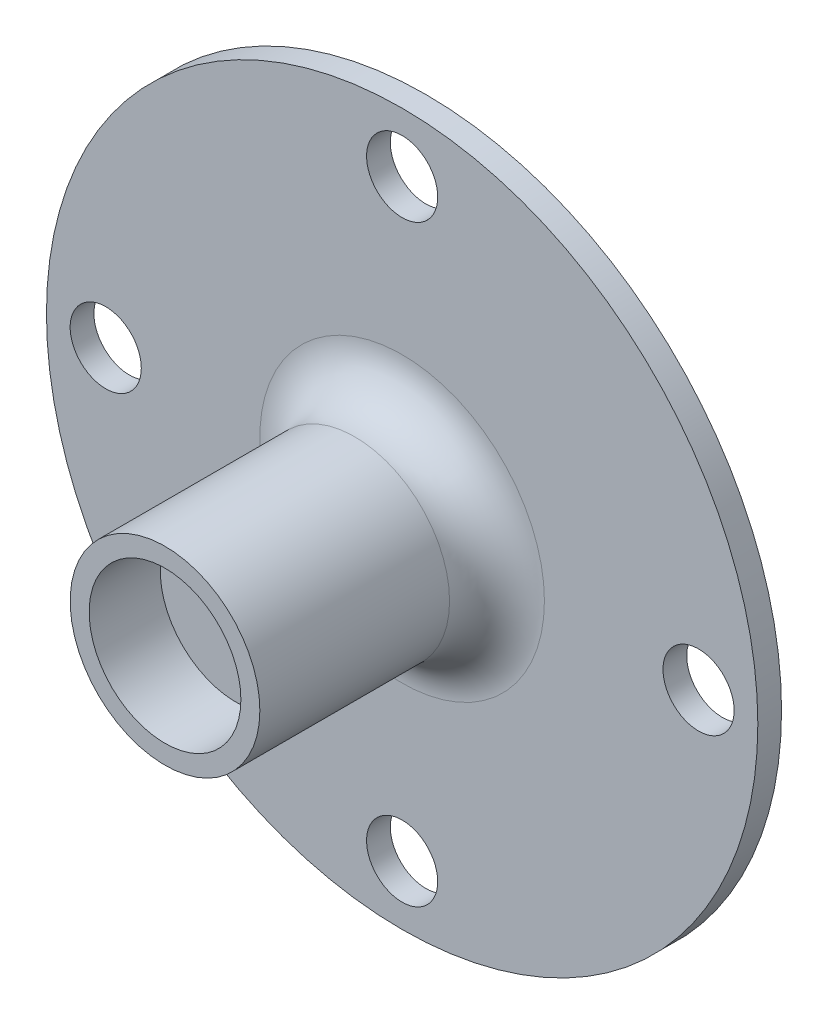
ISO-10303-21;
HEADER;
FILE_DESCRIPTION(('STEP AP214'),'2;1');
FILE_NAME('part.step','',(''),(''),'','','');
FILE_SCHEMA(('AUTOMOTIVE_DESIGN { 1 0 10303 214 1 1 1 1 }'));
ENDSEC;
DATA;
#1=APPLICATION_CONTEXT('core data for automotive mechanical design processes');
#2=APPLICATION_PROTOCOL_DEFINITION('international standard','automotive_design',2000,#1);
#3=PRODUCT_CONTEXT('',#1,'mechanical');
#4=PRODUCT('Part','Part','',(#3));
#5=PRODUCT_RELATED_PRODUCT_CATEGORY('part','',(#4));
#6=PRODUCT_DEFINITION_FORMATION('','',#4);
#7=PRODUCT_DEFINITION_CONTEXT('part definition',#1,'design');
#8=PRODUCT_DEFINITION('design','',#6,#7);
#9=PRODUCT_DEFINITION_SHAPE('','',#8);
#10=(LENGTH_UNIT() NAMED_UNIT(*) SI_UNIT(.MILLI.,.METRE.));
#11=(NAMED_UNIT(*) PLANE_ANGLE_UNIT() SI_UNIT($,.RADIAN.));
#12=(NAMED_UNIT(*) SI_UNIT($,.STERADIAN.) SOLID_ANGLE_UNIT());
#13=UNCERTAINTY_MEASURE_WITH_UNIT(LENGTH_MEASURE(1.E-05),#10,'distance_accuracy_value','');
#14=(GEOMETRIC_REPRESENTATION_CONTEXT(3) GLOBAL_UNCERTAINTY_ASSIGNED_CONTEXT((#13)) GLOBAL_UNIT_ASSIGNED_CONTEXT((#10,
#11,#12)) REPRESENTATION_CONTEXT('',''));
#15=CARTESIAN_POINT('',(0.,0.,0.));
#16=DIRECTION('',(0.,0.,1.));
#17=DIRECTION('',(1.,0.,0.));
#18=AXIS2_PLACEMENT_3D('',#15,#16,#17);
#19=CARTESIAN_POINT('',(-12.5,0.,1.));
#20=DIRECTION('',(0.,0.,-1.));
#21=DIRECTION('',(-1.,0.,0.));
#22=AXIS2_PLACEMENT_3D('',#19,#20,#21);
#23=CYLINDRICAL_SURFACE('',#22,1.5);
#24=CARTESIAN_POINT('',(-12.5,0.,1.));
#25=DIRECTION('',(0.,0.,1.));
#26=DIRECTION('',(1.,0.,0.));
#27=AXIS2_PLACEMENT_3D('',#24,#25,#26);
#28=CIRCLE('',#27,1.5);
#29=CARTESIAN_POINT('',(-11.,0.,1.));
#30=VERTEX_POINT('',#29);
#31=EDGE_CURVE('E70',#30,#30,#28,.T.);
#32=ORIENTED_EDGE('',*,*,#31,.T.);
#33=EDGE_LOOP('',(#32));
#34=FACE_BOUND('',#33,.T.);
#35=CARTESIAN_POINT('',(-12.5,0.,0.));
#36=DIRECTION('',(0.,0.,1.));
#37=DIRECTION('',(1.,0.,0.));
#38=AXIS2_PLACEMENT_3D('',#35,#36,#37);
#39=CIRCLE('',#38,1.5);
#40=CARTESIAN_POINT('',(-11.,0.,0.));
#41=VERTEX_POINT('',#40);
#42=EDGE_CURVE('E55',#41,#41,#39,.T.);
#43=ORIENTED_EDGE('',*,*,#42,.F.);
#44=EDGE_LOOP('',(#43));
#45=FACE_BOUND('',#44,.T.);
#46=ADVANCED_FACE('F33',(#34,#45),#23,.F.);
#47=CARTESIAN_POINT('',(0.,-12.5,1.));
#48=DIRECTION('',(0.,0.,-1.));
#49=DIRECTION('',(-1.,0.,0.));
#50=AXIS2_PLACEMENT_3D('',#47,#48,#49);
#51=CYLINDRICAL_SURFACE('',#50,1.5);
#52=CARTESIAN_POINT('',(0.,-12.5,1.));
#53=DIRECTION('',(0.,0.,1.));
#54=DIRECTION('',(1.,0.,0.));
#55=AXIS2_PLACEMENT_3D('',#52,#53,#54);
#56=CIRCLE('',#55,1.5);
#57=CARTESIAN_POINT('',(1.5,-12.5,1.));
#58=VERTEX_POINT('',#57);
#59=EDGE_CURVE('E73',#58,#58,#56,.T.);
#60=ORIENTED_EDGE('',*,*,#59,.T.);
#61=EDGE_LOOP('',(#60));
#62=FACE_BOUND('',#61,.T.);
#63=CARTESIAN_POINT('',(0.,-12.5,0.));
#64=DIRECTION('',(0.,0.,1.));
#65=DIRECTION('',(1.,0.,0.));
#66=AXIS2_PLACEMENT_3D('',#63,#64,#65);
#67=CIRCLE('',#66,1.5);
#68=CARTESIAN_POINT('',(1.5,-12.5,0.));
#69=VERTEX_POINT('',#68);
#70=EDGE_CURVE('E58',#69,#69,#67,.T.);
#71=ORIENTED_EDGE('',*,*,#70,.F.);
#72=EDGE_LOOP('',(#71));
#73=FACE_BOUND('',#72,.T.);
#74=ADVANCED_FACE('F108',(#62,#73),#51,.F.);
#75=CARTESIAN_POINT('',(12.5,0.,1.));
#76=DIRECTION('',(0.,0.,-1.));
#77=DIRECTION('',(-1.,0.,0.));
#78=AXIS2_PLACEMENT_3D('',#75,#76,#77);
#79=CYLINDRICAL_SURFACE('',#78,1.5);
#80=CARTESIAN_POINT('',(12.5,0.,1.));
#81=DIRECTION('',(0.,0.,1.));
#82=DIRECTION('',(1.,0.,0.));
#83=AXIS2_PLACEMENT_3D('',#80,#81,#82);
#84=CIRCLE('',#83,1.5);
#85=CARTESIAN_POINT('',(14.,0.,1.));
#86=VERTEX_POINT('',#85);
#87=EDGE_CURVE('E76',#86,#86,#84,.T.);
#88=ORIENTED_EDGE('',*,*,#87,.T.);
#89=EDGE_LOOP('',(#88));
#90=FACE_BOUND('',#89,.T.);
#91=CARTESIAN_POINT('',(12.5,0.,0.));
#92=DIRECTION('',(0.,0.,1.));
#93=DIRECTION('',(1.,0.,0.));
#94=AXIS2_PLACEMENT_3D('',#91,#92,#93);
#95=CIRCLE('',#94,1.5);
#96=CARTESIAN_POINT('',(14.,0.,0.));
#97=VERTEX_POINT('',#96);
#98=EDGE_CURVE('E61',#97,#97,#95,.T.);
#99=ORIENTED_EDGE('',*,*,#98,.F.);
#100=EDGE_LOOP('',(#99));
#101=FACE_BOUND('',#100,.T.);
#102=ADVANCED_FACE('F114',(#90,#101),#79,.F.);
#103=CARTESIAN_POINT('',(0.,12.5,1.));
#104=DIRECTION('',(0.,0.,-1.));
#105=DIRECTION('',(-1.,0.,0.));
#106=AXIS2_PLACEMENT_3D('',#103,#104,#105);
#107=CYLINDRICAL_SURFACE('',#106,1.5);
#108=CARTESIAN_POINT('',(0.,12.5,1.));
#109=DIRECTION('',(0.,0.,1.));
#110=DIRECTION('',(1.,0.,0.));
#111=AXIS2_PLACEMENT_3D('',#108,#109,#110);
#112=CIRCLE('',#111,1.5);
#113=CARTESIAN_POINT('',(1.5,12.5,1.));
#114=VERTEX_POINT('',#113);
#115=EDGE_CURVE('E54',#114,#114,#112,.T.);
#116=ORIENTED_EDGE('',*,*,#115,.T.);
#117=EDGE_LOOP('',(#116));
#118=FACE_BOUND('',#117,.T.);
#119=CARTESIAN_POINT('',(0.,12.5,0.));
#120=DIRECTION('',(0.,0.,1.));
#121=DIRECTION('',(1.,0.,0.));
#122=AXIS2_PLACEMENT_3D('',#119,#120,#121);
#123=CIRCLE('',#122,1.5);
#124=CARTESIAN_POINT('',(1.5,12.5,0.));
#125=VERTEX_POINT('',#124);
#126=EDGE_CURVE('E64',#125,#125,#123,.T.);
#127=ORIENTED_EDGE('',*,*,#126,.F.);
#128=EDGE_LOOP('',(#127));
#129=FACE_BOUND('',#128,.T.);
#130=ADVANCED_FACE('F123',(#118,#129),#107,.F.);
#131=CARTESIAN_POINT('',(0.,0.,1.));
#132=DIRECTION('',(0.,0.,-1.));
#133=DIRECTION('',(-1.,0.,0.));
#134=AXIS2_PLACEMENT_3D('',#131,#132,#133);
#135=CYLINDRICAL_SURFACE('',#134,15.);
#136=CARTESIAN_POINT('',(0.,0.,1.));
#137=DIRECTION('',(0.,0.,1.));
#138=DIRECTION('',(1.,0.,0.));
#139=AXIS2_PLACEMENT_3D('',#136,#137,#138);
#140=CIRCLE('',#139,15.);
#141=CARTESIAN_POINT('',(15.,0.,1.));
#142=VERTEX_POINT('',#141);
#143=EDGE_CURVE('E48',#142,#142,#140,.T.);
#144=ORIENTED_EDGE('',*,*,#143,.F.);
#145=EDGE_LOOP('',(#144));
#146=FACE_BOUND('',#145,.T.);
#147=CARTESIAN_POINT('',(0.,0.,0.));
#148=DIRECTION('',(0.,0.,1.));
#149=DIRECTION('',(1.,0.,0.));
#150=AXIS2_PLACEMENT_3D('',#147,#148,#149);
#151=CIRCLE('',#150,15.);
#152=CARTESIAN_POINT('',(15.,0.,0.));
#153=VERTEX_POINT('',#152);
#154=EDGE_CURVE('E51',#153,#153,#151,.T.);
#155=ORIENTED_EDGE('',*,*,#154,.T.);
#156=EDGE_LOOP('',(#155));
#157=FACE_BOUND('',#156,.T.);
#158=ADVANCED_FACE('F119',(#146,#157),#135,.T.);
#159=CARTESIAN_POINT('',(0.,0.,1.));
#160=DIRECTION('',(0.,0.,1.));
#161=DIRECTION('',(1.,0.,0.));
#162=AXIS2_PLACEMENT_3D('',#159,#160,#161);
#163=PLANE('',#162);
#164=CARTESIAN_POINT('',(0.,0.,1.));
#165=DIRECTION('',(0.,0.,1.));
#166=DIRECTION('',(1.,0.,0.));
#167=AXIS2_PLACEMENT_3D('',#164,#165,#166);
#168=CIRCLE('',#167,6.);
#169=CARTESIAN_POINT('',(6.,0.,1.));
#170=VERTEX_POINT('',#169);
#171=EDGE_CURVE('E11',#170,#170,#168,.F.);
#172=ORIENTED_EDGE('',*,*,#171,.T.);
#173=EDGE_LOOP('',(#172));
#174=FACE_BOUND('',#173,.T.);
#175=ORIENTED_EDGE('',*,*,#115,.F.);
#176=EDGE_LOOP('',(#175));
#177=FACE_BOUND('',#176,.T.);
#178=ORIENTED_EDGE('',*,*,#87,.F.);
#179=EDGE_LOOP('',(#178));
#180=FACE_BOUND('',#179,.T.);
#181=ORIENTED_EDGE('',*,*,#59,.F.);
#182=EDGE_LOOP('',(#181));
#183=FACE_BOUND('',#182,.T.);
#184=ORIENTED_EDGE('',*,*,#31,.F.);
#185=EDGE_LOOP('',(#184));
#186=FACE_BOUND('',#185,.T.);
#187=ORIENTED_EDGE('',*,*,#143,.T.);
#188=EDGE_LOOP('',(#187));
#189=FACE_BOUND('',#188,.T.);
#190=ADVANCED_FACE('F130',(#174,#177,#180,#183,#186,#189),#163,.T.);
#191=CARTESIAN_POINT('',(0.,0.,0.));
#192=DIRECTION('',(0.,0.,1.));
#193=DIRECTION('',(1.,0.,0.));
#194=AXIS2_PLACEMENT_3D('',#191,#192,#193);
#195=PLANE('',#194);
#196=ORIENTED_EDGE('',*,*,#126,.T.);
#197=EDGE_LOOP('',(#196));
#198=FACE_BOUND('',#197,.T.);
#199=ORIENTED_EDGE('',*,*,#98,.T.);
#200=EDGE_LOOP('',(#199));
#201=FACE_BOUND('',#200,.T.);
#202=ORIENTED_EDGE('',*,*,#70,.T.);
#203=EDGE_LOOP('',(#202));
#204=FACE_BOUND('',#203,.T.);
#205=ORIENTED_EDGE('',*,*,#42,.T.);
#206=EDGE_LOOP('',(#205));
#207=FACE_BOUND('',#206,.T.);
#208=ORIENTED_EDGE('',*,*,#154,.F.);
#209=EDGE_LOOP('',(#208));
#210=FACE_BOUND('',#209,.T.);
#211=ADVANCED_FACE('F104',(#198,#201,#204,#207,#210),#195,.F.);
#212=CARTESIAN_POINT('',(0.,0.,11.));
#213=DIRECTION('',(0.,0.,-1.));
#214=DIRECTION('',(-1.,0.,0.));
#215=AXIS2_PLACEMENT_3D('',#212,#213,#214);
#216=CYLINDRICAL_SURFACE('',#215,3.2);
#217=CARTESIAN_POINT('',(0.,0.,8.));
#218=DIRECTION('',(0.,0.,1.));
#219=DIRECTION('',(1.,0.,0.));
#220=AXIS2_PLACEMENT_3D('',#217,#218,#219);
#221=CIRCLE('',#220,3.2);
#222=CARTESIAN_POINT('',(3.2,0.,8.));
#223=VERTEX_POINT('',#222);
#224=EDGE_CURVE('E44',#223,#223,#221,.T.);
#225=ORIENTED_EDGE('',*,*,#224,.F.);
#226=EDGE_LOOP('',(#225));
#227=FACE_BOUND('',#226,.T.);
#228=CARTESIAN_POINT('',(0.,0.,11.));
#229=DIRECTION('',(0.,0.,1.));
#230=DIRECTION('',(1.,0.,0.));
#231=AXIS2_PLACEMENT_3D('',#228,#229,#230);
#232=CIRCLE('',#231,3.2);
#233=CARTESIAN_POINT('',(3.2,0.,11.));
#234=VERTEX_POINT('',#233);
#235=EDGE_CURVE('E83',#234,#234,#232,.T.);
#236=ORIENTED_EDGE('',*,*,#235,.T.);
#237=EDGE_LOOP('',(#236));
#238=FACE_BOUND('',#237,.T.);
#239=ADVANCED_FACE('F87',(#227,#238),#216,.F.);
#240=CARTESIAN_POINT('',(0.,0.,11.));
#241=DIRECTION('',(0.,0.,-1.));
#242=DIRECTION('',(-1.,0.,0.));
#243=AXIS2_PLACEMENT_3D('',#240,#241,#242);
#244=CYLINDRICAL_SURFACE('',#243,4.);
#245=CARTESIAN_POINT('',(0.,0.,3.));
#246=DIRECTION('',(0.,0.,1.));
#247=DIRECTION('',(1.,0.,0.));
#248=AXIS2_PLACEMENT_3D('',#245,#246,#247);
#249=CIRCLE('',#248,4.);
#250=CARTESIAN_POINT('',(4.,0.,3.));
#251=VERTEX_POINT('',#250);
#252=EDGE_CURVE('E40',#251,#251,#249,.T.);
#253=ORIENTED_EDGE('',*,*,#252,.T.);
#254=EDGE_LOOP('',(#253));
#255=FACE_BOUND('',#254,.T.);
#256=CARTESIAN_POINT('',(0.,0.,11.));
#257=DIRECTION('',(0.,0.,1.));
#258=DIRECTION('',(1.,0.,0.));
#259=AXIS2_PLACEMENT_3D('',#256,#257,#258);
#260=CIRCLE('',#259,4.);
#261=CARTESIAN_POINT('',(4.,0.,11.));
#262=VERTEX_POINT('',#261);
#263=EDGE_CURVE('E67',#262,#262,#260,.T.);
#264=ORIENTED_EDGE('',*,*,#263,.F.);
#265=EDGE_LOOP('',(#264));
#266=FACE_BOUND('',#265,.T.);
#267=ADVANCED_FACE('F93',(#255,#266),#244,.T.);
#268=CARTESIAN_POINT('',(0.,0.,11.));
#269=DIRECTION('',(0.,0.,1.));
#270=DIRECTION('',(1.,0.,0.));
#271=AXIS2_PLACEMENT_3D('',#268,#269,#270);
#272=PLANE('',#271);
#273=ORIENTED_EDGE('',*,*,#235,.F.);
#274=EDGE_LOOP('',(#273));
#275=FACE_BOUND('',#274,.T.);
#276=ORIENTED_EDGE('',*,*,#263,.T.);
#277=EDGE_LOOP('',(#276));
#278=FACE_BOUND('',#277,.T.);
#279=ADVANCED_FACE('F89',(#275,#278),#272,.T.);
#280=CARTESIAN_POINT('',(0.,0.,8.));
#281=DIRECTION('',(0.,0.,1.));
#282=DIRECTION('',(1.,0.,0.));
#283=AXIS2_PLACEMENT_3D('',#280,#281,#282);
#284=PLANE('',#283);
#285=ORIENTED_EDGE('',*,*,#224,.T.);
#286=EDGE_LOOP('',(#285));
#287=FACE_BOUND('',#286,.T.);
#288=ADVANCED_FACE('F92',(#287),#284,.T.);
#289=CARTESIAN_POINT('',(0.,0.,3.));
#290=DIRECTION('',(0.,0.,1.));
#291=DIRECTION('',(1.,0.,0.));
#292=AXIS2_PLACEMENT_3D('',#289,#290,#291);
#293=TOROIDAL_SURFACE('',#292,6.,2.);
#294=ORIENTED_EDGE('',*,*,#171,.F.);
#295=EDGE_LOOP('',(#294));
#296=FACE_BOUND('',#295,.T.);
#297=ORIENTED_EDGE('',*,*,#252,.F.);
#298=EDGE_LOOP('',(#297));
#299=FACE_BOUND('',#298,.T.);
#300=ADVANCED_FACE('F35',(#296,#299),#293,.F.);
#301=CLOSED_SHELL('',(#46,#74,#102,#130,#158,#190,#211,#239,#267,#279,#288,#300));
#302=MANIFOLD_SOLID_BREP('B2',#301);
#303=ADVANCED_BREP_SHAPE_REPRESENTATION('',(#18,#302),#14);
#304=SHAPE_DEFINITION_REPRESENTATION(#9,#303);
ENDSEC;
END-ISO-10303-21;
